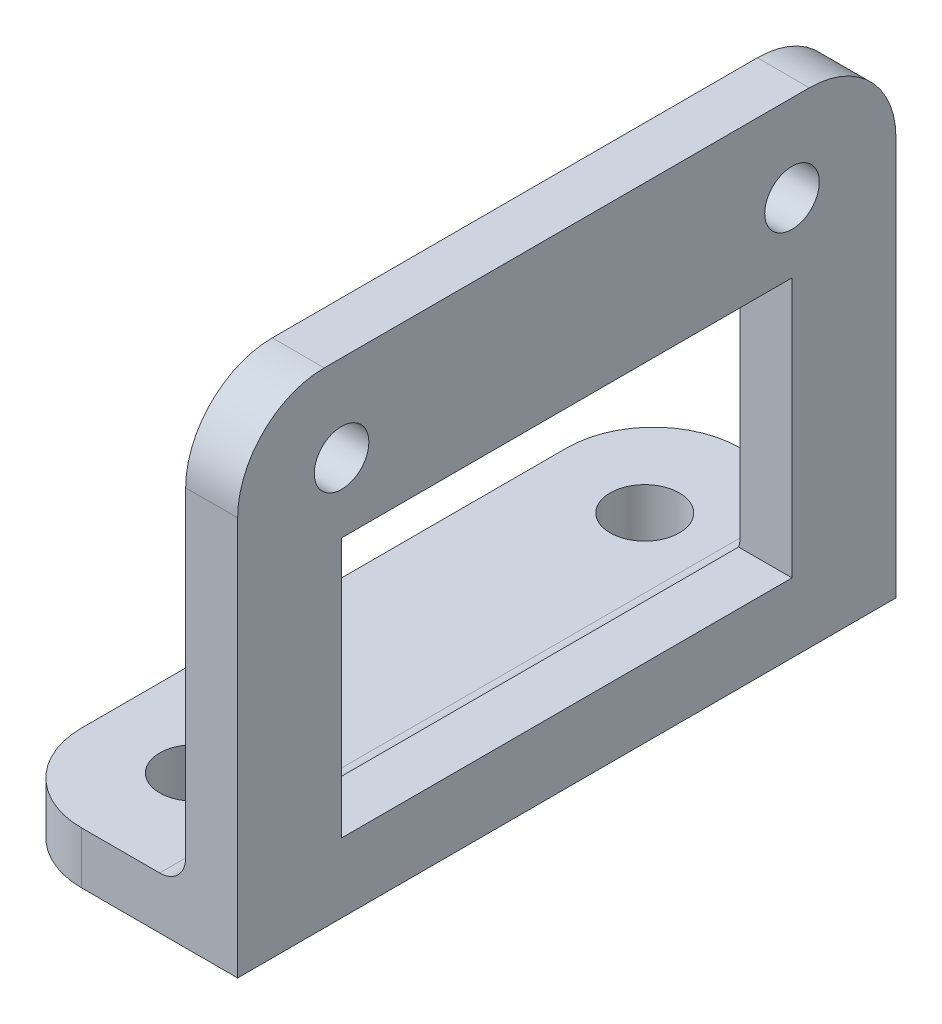
ISO-10303-21;
HEADER;
FILE_DESCRIPTION(('STEP AP214'),'2;1');
FILE_NAME('part.step','',(''),(''),'','','');
FILE_SCHEMA(('AUTOMOTIVE_DESIGN { 1 0 10303 214 1 1 1 1 }'));
ENDSEC;
DATA;
#1=APPLICATION_CONTEXT('core data for automotive mechanical design processes');
#2=APPLICATION_PROTOCOL_DEFINITION('international standard','automotive_design',2000,#1);
#3=PRODUCT_CONTEXT('',#1,'mechanical');
#4=PRODUCT('Part','Part','',(#3));
#5=PRODUCT_RELATED_PRODUCT_CATEGORY('part','',(#4));
#6=PRODUCT_DEFINITION_FORMATION('','',#4);
#7=PRODUCT_DEFINITION_CONTEXT('part definition',#1,'design');
#8=PRODUCT_DEFINITION('design','',#6,#7);
#9=PRODUCT_DEFINITION_SHAPE('','',#8);
#10=(LENGTH_UNIT() NAMED_UNIT(*) SI_UNIT(.MILLI.,.METRE.));
#11=(NAMED_UNIT(*) PLANE_ANGLE_UNIT() SI_UNIT($,.RADIAN.));
#12=(NAMED_UNIT(*) SI_UNIT($,.STERADIAN.) SOLID_ANGLE_UNIT());
#13=UNCERTAINTY_MEASURE_WITH_UNIT(LENGTH_MEASURE(1.E-05),#10,'distance_accuracy_value','');
#14=(GEOMETRIC_REPRESENTATION_CONTEXT(3) GLOBAL_UNCERTAINTY_ASSIGNED_CONTEXT((#13)) GLOBAL_UNIT_ASSIGNED_CONTEXT((#10,
#11,#12)) REPRESENTATION_CONTEXT('',''));
#15=CARTESIAN_POINT('',(0.,0.,0.));
#16=DIRECTION('',(0.,0.,1.));
#17=DIRECTION('',(1.,0.,0.));
#18=AXIS2_PLACEMENT_3D('',#15,#16,#17);
#19=CARTESIAN_POINT('',(0.,0.,19.));
#20=DIRECTION('',(0.,1.,0.));
#21=DIRECTION('',(0.,0.,1.));
#22=AXIS2_PLACEMENT_3D('',#19,#20,#21);
#23=PLANE('',#22);
#24=CARTESIAN_POINT('',(-4.5,0.,-13.));
#25=DIRECTION('',(0.,1.,0.));
#26=DIRECTION('',(-1.,0.,0.));
#27=AXIS2_PLACEMENT_3D('',#24,#25,#26);
#28=CIRCLE('',#27,2.);
#29=CARTESIAN_POINT('',(-6.5,0.,-13.));
#30=VERTEX_POINT('',#29);
#31=EDGE_CURVE('E223',#30,#30,#28,.T.);
#32=ORIENTED_EDGE('',*,*,#31,.T.);
#33=EDGE_LOOP('',(#32));
#34=FACE_BOUND('',#33,.T.);
#35=CARTESIAN_POINT('',(-4.5,0.,13.));
#36=DIRECTION('',(0.,1.,0.));
#37=DIRECTION('',(1.,0.,0.));
#38=AXIS2_PLACEMENT_3D('',#35,#36,#37);
#39=CIRCLE('',#38,2.);
#40=CARTESIAN_POINT('',(-2.5,0.,13.));
#41=VERTEX_POINT('',#40);
#42=EDGE_CURVE('E217',#41,#41,#39,.T.);
#43=ORIENTED_EDGE('',*,*,#42,.T.);
#44=EDGE_LOOP('',(#43));
#45=FACE_BOUND('',#44,.T.);
#46=DIRECTION('',(0.,0.,-1.));
#47=VECTOR('',#46,1.);
#48=CARTESIAN_POINT('',(-10.,0.,19.));
#49=LINE('',#48,#47);
#50=CARTESIAN_POINT('',(-10.,0.,14.));
#51=VERTEX_POINT('',#50);
#52=CARTESIAN_POINT('',(-10.,0.,-14.));
#53=VERTEX_POINT('',#52);
#54=EDGE_CURVE('E245',#51,#53,#49,.T.);
#55=ORIENTED_EDGE('',*,*,#54,.T.);
#56=CARTESIAN_POINT('',(-5.,0.,-14.));
#57=DIRECTION('',(0.,1.,0.));
#58=DIRECTION('',(0.,0.,1.));
#59=AXIS2_PLACEMENT_3D('',#56,#57,#58);
#60=CIRCLE('',#59,5.);
#61=CARTESIAN_POINT('',(-5.,0.,-19.));
#62=VERTEX_POINT('',#61);
#63=EDGE_CURVE('E345',#53,#62,#60,.F.);
#64=ORIENTED_EDGE('',*,*,#63,.T.);
#65=DIRECTION('',(1.,0.,0.));
#66=VECTOR('',#65,1.);
#67=CARTESIAN_POINT('',(0.,0.,-19.));
#68=LINE('',#67,#66);
#69=CARTESIAN_POINT('',(4.,0.,-19.));
#70=VERTEX_POINT('',#69);
#71=EDGE_CURVE('E246',#62,#70,#68,.T.);
#72=ORIENTED_EDGE('',*,*,#71,.T.);
#73=DIRECTION('',(0.,0.,-1.));
#74=VECTOR('',#73,1.);
#75=CARTESIAN_POINT('',(4.,0.,19.));
#76=LINE('',#75,#74);
#77=CARTESIAN_POINT('',(4.,0.,19.));
#78=VERTEX_POINT('',#77);
#79=EDGE_CURVE('E274',#78,#70,#76,.T.);
#80=ORIENTED_EDGE('',*,*,#79,.F.);
#81=DIRECTION('',(1.,0.,0.));
#82=VECTOR('',#81,1.);
#83=CARTESIAN_POINT('',(0.,0.,19.));
#84=LINE('',#83,#82);
#85=CARTESIAN_POINT('',(-5.,0.,19.));
#86=VERTEX_POINT('',#85);
#87=EDGE_CURVE('E231',#86,#78,#84,.T.);
#88=ORIENTED_EDGE('',*,*,#87,.F.);
#89=CARTESIAN_POINT('',(-5.,0.,14.));
#90=DIRECTION('',(0.,1.,0.));
#91=DIRECTION('',(0.,0.,1.));
#92=AXIS2_PLACEMENT_3D('',#89,#90,#91);
#93=CIRCLE('',#92,5.);
#94=EDGE_CURVE('E69',#86,#51,#93,.F.);
#95=ORIENTED_EDGE('',*,*,#94,.T.);
#96=EDGE_LOOP('',(#55,#64,#72,#80,#88,#95));
#97=FACE_BOUND('',#96,.T.);
#98=ADVANCED_FACE('F45',(#34,#45,#97),#23,.F.);
#99=CARTESIAN_POINT('',(4.,0.,19.));
#100=DIRECTION('',(-1.,0.,0.));
#101=DIRECTION('',(0.,0.,1.));
#102=AXIS2_PLACEMENT_3D('',#99,#100,#101);
#103=PLANE('',#102);
#104=DIRECTION('',(0.,0.,1.));
#105=VECTOR('',#104,1.);
#106=CARTESIAN_POINT('',(4.,4.,-13.));
#107=LINE('',#106,#105);
#108=CARTESIAN_POINT('',(4.,4.,-13.));
#109=VERTEX_POINT('',#108);
#110=CARTESIAN_POINT('',(4.,4.,13.));
#111=VERTEX_POINT('',#110);
#112=EDGE_CURVE('E205',#109,#111,#107,.T.);
#113=ORIENTED_EDGE('',*,*,#112,.T.);
#114=DIRECTION('',(0.,1.,0.));
#115=VECTOR('',#114,1.);
#116=CARTESIAN_POINT('',(4.,4.,13.));
#117=LINE('',#116,#115);
#118=CARTESIAN_POINT('',(4.,19.,13.));
#119=VERTEX_POINT('',#118);
#120=EDGE_CURVE('E192',#111,#119,#117,.T.);
#121=ORIENTED_EDGE('',*,*,#120,.T.);
#122=DIRECTION('',(0.,0.,-1.));
#123=VECTOR('',#122,1.);
#124=CARTESIAN_POINT('',(4.,19.,-13.));
#125=LINE('',#124,#123);
#126=CARTESIAN_POINT('',(4.,19.,-13.));
#127=VERTEX_POINT('',#126);
#128=EDGE_CURVE('E196',#119,#127,#125,.T.);
#129=ORIENTED_EDGE('',*,*,#128,.T.);
#130=DIRECTION('',(0.,-1.,0.));
#131=VECTOR('',#130,1.);
#132=CARTESIAN_POINT('',(4.,4.,-13.));
#133=LINE('',#132,#131);
#134=EDGE_CURVE('E169',#127,#109,#133,.T.);
#135=ORIENTED_EDGE('',*,*,#134,.T.);
#136=EDGE_LOOP('',(#113,#121,#129,#135));
#137=FACE_BOUND('',#136,.T.);
#138=CARTESIAN_POINT('',(4.,23.,13.));
#139=DIRECTION('',(-1.,0.,0.));
#140=DIRECTION('',(0.,0.,-1.));
#141=AXIS2_PLACEMENT_3D('',#138,#139,#140);
#142=CIRCLE('',#141,1.575);
#143=CARTESIAN_POINT('',(4.,23.,11.425));
#144=VERTEX_POINT('',#143);
#145=EDGE_CURVE('E204',#144,#144,#142,.T.);
#146=ORIENTED_EDGE('',*,*,#145,.T.);
#147=EDGE_LOOP('',(#146));
#148=FACE_BOUND('',#147,.T.);
#149=CARTESIAN_POINT('',(4.,23.,-13.));
#150=DIRECTION('',(-1.,0.,0.));
#151=DIRECTION('',(0.,0.,1.));
#152=AXIS2_PLACEMENT_3D('',#149,#150,#151);
#153=CIRCLE('',#152,1.575);
#154=CARTESIAN_POINT('',(4.,23.,-11.425));
#155=VERTEX_POINT('',#154);
#156=EDGE_CURVE('E213',#155,#155,#153,.T.);
#157=ORIENTED_EDGE('',*,*,#156,.T.);
#158=EDGE_LOOP('',(#157));
#159=FACE_BOUND('',#158,.T.);
#160=DIRECTION('',(0.,1.,0.));
#161=VECTOR('',#160,1.);
#162=CARTESIAN_POINT('',(4.,0.,-19.));
#163=LINE('',#162,#161);
#164=CARTESIAN_POINT('',(4.,23.,-19.));
#165=VERTEX_POINT('',#164);
#166=EDGE_CURVE('E249',#70,#165,#163,.T.);
#167=ORIENTED_EDGE('',*,*,#166,.T.);
#168=CARTESIAN_POINT('',(4.,23.,-14.));
#169=DIRECTION('',(-1.,0.,0.));
#170=DIRECTION('',(0.,0.,1.));
#171=AXIS2_PLACEMENT_3D('',#168,#169,#170);
#172=CIRCLE('',#171,5.);
#173=CARTESIAN_POINT('',(4.,28.,-14.));
#174=VERTEX_POINT('',#173);
#175=EDGE_CURVE('E333',#165,#174,#172,.F.);
#176=ORIENTED_EDGE('',*,*,#175,.T.);
#177=DIRECTION('',(0.,0.,-1.));
#178=VECTOR('',#177,1.);
#179=CARTESIAN_POINT('',(4.,28.,19.));
#180=LINE('',#179,#178);
#181=CARTESIAN_POINT('',(4.,28.,14.));
#182=VERTEX_POINT('',#181);
#183=EDGE_CURVE('E270',#182,#174,#180,.T.);
#184=ORIENTED_EDGE('',*,*,#183,.F.);
#185=CARTESIAN_POINT('',(4.,23.,14.));
#186=DIRECTION('',(-1.,0.,0.));
#187=DIRECTION('',(0.,0.,1.));
#188=AXIS2_PLACEMENT_3D('',#185,#186,#187);
#189=CIRCLE('',#188,5.);
#190=CARTESIAN_POINT('',(4.,23.,19.));
#191=VERTEX_POINT('',#190);
#192=EDGE_CURVE('E330',#182,#191,#189,.F.);
#193=ORIENTED_EDGE('',*,*,#192,.T.);
#194=DIRECTION('',(0.,1.,0.));
#195=VECTOR('',#194,1.);
#196=CARTESIAN_POINT('',(4.,0.,19.));
#197=LINE('',#196,#195);
#198=EDGE_CURVE('E234',#78,#191,#197,.T.);
#199=ORIENTED_EDGE('',*,*,#198,.F.);
#200=ORIENTED_EDGE('',*,*,#79,.T.);
#201=EDGE_LOOP('',(#167,#176,#184,#193,#199,#200));
#202=FACE_BOUND('',#201,.T.);
#203=ADVANCED_FACE('F388',(#137,#148,#159,#202),#103,.F.);
#204=CARTESIAN_POINT('',(1.,28.,19.));
#205=DIRECTION('',(0.,-1.,0.));
#206=DIRECTION('',(0.,0.,-1.));
#207=AXIS2_PLACEMENT_3D('',#204,#205,#206);
#208=PLANE('',#207);
#209=ORIENTED_EDGE('',*,*,#183,.T.);
#210=DIRECTION('',(-1.,0.,0.));
#211=VECTOR('',#210,1.);
#212=CARTESIAN_POINT('',(1.,28.,-14.));
#213=LINE('',#212,#211);
#214=CARTESIAN_POINT('',(1.,28.,-14.));
#215=VERTEX_POINT('',#214);
#216=EDGE_CURVE('E314',#174,#215,#213,.T.);
#217=ORIENTED_EDGE('',*,*,#216,.T.);
#218=DIRECTION('',(0.,0.,-1.));
#219=VECTOR('',#218,1.);
#220=CARTESIAN_POINT('',(1.,28.,19.));
#221=LINE('',#220,#219);
#222=CARTESIAN_POINT('',(1.,28.,14.));
#223=VERTEX_POINT('',#222);
#224=EDGE_CURVE('E267',#223,#215,#221,.T.);
#225=ORIENTED_EDGE('',*,*,#224,.F.);
#226=DIRECTION('',(-1.,0.,0.));
#227=VECTOR('',#226,1.);
#228=CARTESIAN_POINT('',(1.,28.,14.));
#229=LINE('',#228,#227);
#230=EDGE_CURVE('E311',#223,#182,#229,.F.);
#231=ORIENTED_EDGE('',*,*,#230,.T.);
#232=EDGE_LOOP('',(#209,#217,#225,#231));
#233=FACE_BOUND('',#232,.T.);
#234=ADVANCED_FACE('F392',(#233),#208,.F.);
#235=CARTESIAN_POINT('',(1.,3.,19.));
#236=DIRECTION('',(1.,0.,0.));
#237=DIRECTION('',(0.,1.,0.));
#238=AXIS2_PLACEMENT_3D('',#235,#236,#237);
#239=PLANE('',#238);
#240=ORIENTED_EDGE('',*,*,#224,.T.);
#241=CARTESIAN_POINT('',(1.,23.,-14.));
#242=DIRECTION('',(1.,0.,0.));
#243=DIRECTION('',(0.,1.,0.));
#244=AXIS2_PLACEMENT_3D('',#241,#242,#243);
#245=CIRCLE('',#244,5.);
#246=CARTESIAN_POINT('',(1.,23.,-19.));
#247=VERTEX_POINT('',#246);
#248=EDGE_CURVE('E321',#215,#247,#245,.F.);
#249=ORIENTED_EDGE('',*,*,#248,.T.);
#250=DIRECTION('',(0.,-1.,0.));
#251=VECTOR('',#250,1.);
#252=CARTESIAN_POINT('',(1.,3.,-19.));
#253=LINE('',#252,#251);
#254=CARTESIAN_POINT('',(1.,4.5,-19.));
#255=VERTEX_POINT('',#254);
#256=EDGE_CURVE('E254',#247,#255,#253,.T.);
#257=ORIENTED_EDGE('',*,*,#256,.T.);
#258=DIRECTION('',(0.,0.,-1.));
#259=VECTOR('',#258,1.);
#260=CARTESIAN_POINT('',(1.,4.5,19.));
#261=LINE('',#260,#259);
#262=CARTESIAN_POINT('',(1.,4.5,-13.));
#263=VERTEX_POINT('',#262);
#264=EDGE_CURVE('E190',#255,#263,#261,.F.);
#265=ORIENTED_EDGE('',*,*,#264,.T.);
#266=DIRECTION('',(0.,-1.,0.));
#267=VECTOR('',#266,1.);
#268=CARTESIAN_POINT('',(1.,4.,-13.));
#269=LINE('',#268,#267);
#270=CARTESIAN_POINT('',(1.,19.,-13.));
#271=VERTEX_POINT('',#270);
#272=EDGE_CURVE('E166',#271,#263,#269,.T.);
#273=ORIENTED_EDGE('',*,*,#272,.F.);
#274=DIRECTION('',(0.,0.,-1.));
#275=VECTOR('',#274,1.);
#276=CARTESIAN_POINT('',(1.,19.,-13.));
#277=LINE('',#276,#275);
#278=CARTESIAN_POINT('',(1.,19.,13.));
#279=VERTEX_POINT('',#278);
#280=EDGE_CURVE('E179',#279,#271,#277,.T.);
#281=ORIENTED_EDGE('',*,*,#280,.F.);
#282=DIRECTION('',(0.,1.,0.));
#283=VECTOR('',#282,1.);
#284=CARTESIAN_POINT('',(1.,4.,13.));
#285=LINE('',#284,#283);
#286=CARTESIAN_POINT('',(1.,4.5,13.));
#287=VERTEX_POINT('',#286);
#288=EDGE_CURVE('E184',#287,#279,#285,.T.);
#289=ORIENTED_EDGE('',*,*,#288,.F.);
#290=DIRECTION('',(0.,0.,-1.));
#291=VECTOR('',#290,1.);
#292=CARTESIAN_POINT('',(1.,4.5,19.));
#293=LINE('',#292,#291);
#294=CARTESIAN_POINT('',(1.,4.5,19.));
#295=VERTEX_POINT('',#294);
#296=EDGE_CURVE('E288',#287,#295,#293,.F.);
#297=ORIENTED_EDGE('',*,*,#296,.T.);
#298=DIRECTION('',(0.,-1.,0.));
#299=VECTOR('',#298,1.);
#300=CARTESIAN_POINT('',(1.,3.,19.));
#301=LINE('',#300,#299);
#302=CARTESIAN_POINT('',(1.,23.,19.));
#303=VERTEX_POINT('',#302);
#304=EDGE_CURVE('E239',#303,#295,#301,.T.);
#305=ORIENTED_EDGE('',*,*,#304,.F.);
#306=CARTESIAN_POINT('',(1.,23.,14.));
#307=DIRECTION('',(1.,0.,0.));
#308=DIRECTION('',(0.,1.,0.));
#309=AXIS2_PLACEMENT_3D('',#306,#307,#308);
#310=CIRCLE('',#309,5.);
#311=EDGE_CURVE('E318',#303,#223,#310,.F.);
#312=ORIENTED_EDGE('',*,*,#311,.T.);
#313=EDGE_LOOP('',(#240,#249,#257,#265,#273,#281,#289,#297,#305,#312));
#314=FACE_BOUND('',#313,.T.);
#315=CARTESIAN_POINT('',(1.,23.,13.));
#316=DIRECTION('',(-1.,0.,0.));
#317=DIRECTION('',(0.,0.,-1.));
#318=AXIS2_PLACEMENT_3D('',#315,#316,#317);
#319=CIRCLE('',#318,1.575);
#320=CARTESIAN_POINT('',(1.,23.,11.425));
#321=VERTEX_POINT('',#320);
#322=EDGE_CURVE('E222',#321,#321,#319,.T.);
#323=ORIENTED_EDGE('',*,*,#322,.F.);
#324=EDGE_LOOP('',(#323));
#325=FACE_BOUND('',#324,.T.);
#326=CARTESIAN_POINT('',(1.,23.,-13.));
#327=DIRECTION('',(-1.,0.,0.));
#328=DIRECTION('',(0.,0.,1.));
#329=AXIS2_PLACEMENT_3D('',#326,#327,#328);
#330=CIRCLE('',#329,1.575);
#331=CARTESIAN_POINT('',(1.,23.,-11.425));
#332=VERTEX_POINT('',#331);
#333=EDGE_CURVE('E218',#332,#332,#330,.T.);
#334=ORIENTED_EDGE('',*,*,#333,.F.);
#335=EDGE_LOOP('',(#334));
#336=FACE_BOUND('',#335,.T.);
#337=ADVANCED_FACE('F187',(#314,#325,#336),#239,.F.);
#338=CARTESIAN_POINT('',(1.,3.,19.));
#339=DIRECTION('',(0.,-1.,0.));
#340=DIRECTION('',(1.,0.,0.));
#341=AXIS2_PLACEMENT_3D('',#338,#339,#340);
#342=PLANE('',#341);
#343=CARTESIAN_POINT('',(-4.5,3.,-13.));
#344=DIRECTION('',(0.,-1.,0.));
#345=DIRECTION('',(1.,0.,0.));
#346=AXIS2_PLACEMENT_3D('',#343,#344,#345);
#347=CIRCLE('',#346,2.);
#348=CARTESIAN_POINT('',(-2.5,3.,-13.));
#349=VERTEX_POINT('',#348);
#350=EDGE_CURVE('E250',#349,#349,#347,.T.);
#351=ORIENTED_EDGE('',*,*,#350,.T.);
#352=EDGE_LOOP('',(#351));
#353=FACE_BOUND('',#352,.T.);
#354=CARTESIAN_POINT('',(-4.5,3.,13.));
#355=DIRECTION('',(0.,-1.,0.));
#356=DIRECTION('',(1.,0.,0.));
#357=AXIS2_PLACEMENT_3D('',#354,#355,#356);
#358=CIRCLE('',#357,2.);
#359=CARTESIAN_POINT('',(-2.5,3.,13.));
#360=VERTEX_POINT('',#359);
#361=EDGE_CURVE('E227',#360,#360,#358,.T.);
#362=ORIENTED_EDGE('',*,*,#361,.T.);
#363=EDGE_LOOP('',(#362));
#364=FACE_BOUND('',#363,.T.);
#365=DIRECTION('',(-1.,0.,0.));
#366=VECTOR('',#365,1.);
#367=CARTESIAN_POINT('',(1.,3.,-19.));
#368=LINE('',#367,#366);
#369=CARTESIAN_POINT('',(-0.5,3.,-19.));
#370=VERTEX_POINT('',#369);
#371=CARTESIAN_POINT('',(-5.,3.,-19.));
#372=VERTEX_POINT('',#371);
#373=EDGE_CURVE('E235',#370,#372,#368,.T.);
#374=ORIENTED_EDGE('',*,*,#373,.T.);
#375=CARTESIAN_POINT('',(-5.,3.,-14.));
#376=DIRECTION('',(0.,-1.,0.));
#377=DIRECTION('',(1.,0.,0.));
#378=AXIS2_PLACEMENT_3D('',#375,#376,#377);
#379=CIRCLE('',#378,5.);
#380=CARTESIAN_POINT('',(-10.,3.,-14.));
#381=VERTEX_POINT('',#380);
#382=EDGE_CURVE('E350',#372,#381,#379,.F.);
#383=ORIENTED_EDGE('',*,*,#382,.T.);
#384=DIRECTION('',(0.,0.,-1.));
#385=VECTOR('',#384,1.);
#386=CARTESIAN_POINT('',(-10.,3.,19.));
#387=LINE('',#386,#385);
#388=CARTESIAN_POINT('',(-10.,3.,14.));
#389=VERTEX_POINT('',#388);
#390=EDGE_CURVE('E263',#389,#381,#387,.T.);
#391=ORIENTED_EDGE('',*,*,#390,.F.);
#392=CARTESIAN_POINT('',(-5.,3.,14.));
#393=DIRECTION('',(0.,-1.,0.));
#394=DIRECTION('',(1.,0.,0.));
#395=AXIS2_PLACEMENT_3D('',#392,#393,#394);
#396=CIRCLE('',#395,5.);
#397=CARTESIAN_POINT('',(-5.,3.,19.));
#398=VERTEX_POINT('',#397);
#399=EDGE_CURVE('E61',#389,#398,#396,.F.);
#400=ORIENTED_EDGE('',*,*,#399,.T.);
#401=DIRECTION('',(-1.,0.,0.));
#402=VECTOR('',#401,1.);
#403=CARTESIAN_POINT('',(1.,3.,19.));
#404=LINE('',#403,#402);
#405=CARTESIAN_POINT('',(-0.5,3.,19.));
#406=VERTEX_POINT('',#405);
#407=EDGE_CURVE('E242',#406,#398,#404,.T.);
#408=ORIENTED_EDGE('',*,*,#407,.F.);
#409=DIRECTION('',(0.,0.,-1.));
#410=VECTOR('',#409,1.);
#411=CARTESIAN_POINT('',(-0.5,3.,-19.));
#412=LINE('',#411,#410);
#413=EDGE_CURVE('E278',#406,#370,#412,.T.);
#414=ORIENTED_EDGE('',*,*,#413,.T.);
#415=EDGE_LOOP('',(#374,#383,#391,#400,#408,#414));
#416=FACE_BOUND('',#415,.T.);
#417=ADVANCED_FACE('F368',(#353,#364,#416),#342,.F.);
#418=CARTESIAN_POINT('',(-10.,0.,19.));
#419=DIRECTION('',(1.,0.,0.));
#420=DIRECTION('',(0.,0.,-1.));
#421=AXIS2_PLACEMENT_3D('',#418,#419,#420);
#422=PLANE('',#421);
#423=ORIENTED_EDGE('',*,*,#390,.T.);
#424=DIRECTION('',(0.,-1.,0.));
#425=VECTOR('',#424,1.);
#426=CARTESIAN_POINT('',(-10.,0.,-14.));
#427=LINE('',#426,#425);
#428=EDGE_CURVE('E339',#381,#53,#427,.T.);
#429=ORIENTED_EDGE('',*,*,#428,.T.);
#430=ORIENTED_EDGE('',*,*,#54,.F.);
#431=DIRECTION('',(0.,-1.,0.));
#432=VECTOR('',#431,1.);
#433=CARTESIAN_POINT('',(-10.,0.,14.));
#434=LINE('',#433,#432);
#435=EDGE_CURVE('E336',#51,#389,#434,.F.);
#436=ORIENTED_EDGE('',*,*,#435,.T.);
#437=EDGE_LOOP('',(#423,#429,#430,#436));
#438=FACE_BOUND('',#437,.T.);
#439=ADVANCED_FACE('F381',(#438),#422,.F.);
#440=CARTESIAN_POINT('',(0.,0.,19.));
#441=DIRECTION('',(0.,0.,-1.));
#442=DIRECTION('',(-1.,0.,0.));
#443=AXIS2_PLACEMENT_3D('',#440,#441,#442);
#444=PLANE('',#443);
#445=ORIENTED_EDGE('',*,*,#407,.T.);
#446=DIRECTION('',(0.,-1.,0.));
#447=VECTOR('',#446,1.);
#448=CARTESIAN_POINT('',(-5.,0.,19.));
#449=LINE('',#448,#447);
#450=EDGE_CURVE('E11',#398,#86,#449,.T.);
#451=ORIENTED_EDGE('',*,*,#450,.T.);
#452=ORIENTED_EDGE('',*,*,#87,.T.);
#453=ORIENTED_EDGE('',*,*,#198,.T.);
#454=DIRECTION('',(-1.,0.,0.));
#455=VECTOR('',#454,1.);
#456=CARTESIAN_POINT('',(0.,23.,19.));
#457=LINE('',#456,#455);
#458=EDGE_CURVE('E54',#191,#303,#457,.T.);
#459=ORIENTED_EDGE('',*,*,#458,.T.);
#460=ORIENTED_EDGE('',*,*,#304,.T.);
#461=CARTESIAN_POINT('',(-0.5,4.5,19.));
#462=DIRECTION('',(0.,0.,-1.));
#463=DIRECTION('',(-1.,0.,0.));
#464=AXIS2_PLACEMENT_3D('',#461,#462,#463);
#465=CIRCLE('',#464,1.5);
#466=EDGE_CURVE('E308',#295,#406,#465,.T.);
#467=ORIENTED_EDGE('',*,*,#466,.T.);
#468=EDGE_LOOP('',(#445,#451,#452,#453,#459,#460,#467));
#469=FACE_BOUND('',#468,.T.);
#470=ADVANCED_FACE('F357',(#469),#444,.F.);
#471=CARTESIAN_POINT('',(0.,0.,-19.));
#472=DIRECTION('',(0.,0.,-1.));
#473=DIRECTION('',(-1.,0.,0.));
#474=AXIS2_PLACEMENT_3D('',#471,#472,#473);
#475=PLANE('',#474);
#476=ORIENTED_EDGE('',*,*,#256,.F.);
#477=DIRECTION('',(-1.,0.,0.));
#478=VECTOR('',#477,1.);
#479=CARTESIAN_POINT('',(4.,23.,-19.));
#480=LINE('',#479,#478);
#481=EDGE_CURVE('E327',#247,#165,#480,.F.);
#482=ORIENTED_EDGE('',*,*,#481,.T.);
#483=ORIENTED_EDGE('',*,*,#166,.F.);
#484=ORIENTED_EDGE('',*,*,#71,.F.);
#485=DIRECTION('',(0.,-1.,0.));
#486=VECTOR('',#485,1.);
#487=CARTESIAN_POINT('',(-5.,3.,-19.));
#488=LINE('',#487,#486);
#489=EDGE_CURVE('E324',#62,#372,#488,.F.);
#490=ORIENTED_EDGE('',*,*,#489,.T.);
#491=ORIENTED_EDGE('',*,*,#373,.F.);
#492=CARTESIAN_POINT('',(-0.5,4.5,-19.));
#493=DIRECTION('',(0.,0.,-1.));
#494=DIRECTION('',(-1.,0.,0.));
#495=AXIS2_PLACEMENT_3D('',#492,#493,#494);
#496=CIRCLE('',#495,1.5);
#497=EDGE_CURVE('E294',#370,#255,#496,.F.);
#498=ORIENTED_EDGE('',*,*,#497,.T.);
#499=EDGE_LOOP('',(#476,#482,#483,#484,#490,#491,#498));
#500=FACE_BOUND('',#499,.T.);
#501=ADVANCED_FACE('F373',(#500),#475,.T.);
#502=CARTESIAN_POINT('',(-4.5,0.,13.));
#503=DIRECTION('',(0.,1.,0.));
#504=DIRECTION('',(-1.,0.,0.));
#505=AXIS2_PLACEMENT_3D('',#502,#503,#504);
#506=CYLINDRICAL_SURFACE('',#505,2.);
#507=ORIENTED_EDGE('',*,*,#42,.F.);
#508=EDGE_LOOP('',(#507));
#509=FACE_BOUND('',#508,.T.);
#510=ORIENTED_EDGE('',*,*,#361,.F.);
#511=EDGE_LOOP('',(#510));
#512=FACE_BOUND('',#511,.T.);
#513=ADVANCED_FACE('F427',(#509,#512),#506,.F.);
#514=CARTESIAN_POINT('',(-4.5,0.,-13.));
#515=DIRECTION('',(0.,1.,0.));
#516=DIRECTION('',(-1.,0.,0.));
#517=AXIS2_PLACEMENT_3D('',#514,#515,#516);
#518=CYLINDRICAL_SURFACE('',#517,2.);
#519=ORIENTED_EDGE('',*,*,#31,.F.);
#520=EDGE_LOOP('',(#519));
#521=FACE_BOUND('',#520,.T.);
#522=ORIENTED_EDGE('',*,*,#350,.F.);
#523=EDGE_LOOP('',(#522));
#524=FACE_BOUND('',#523,.T.);
#525=ADVANCED_FACE('F432',(#521,#524),#518,.F.);
#526=CARTESIAN_POINT('',(4.,23.,-13.));
#527=DIRECTION('',(-1.,0.,0.));
#528=DIRECTION('',(0.,0.,1.));
#529=AXIS2_PLACEMENT_3D('',#526,#527,#528);
#530=CYLINDRICAL_SURFACE('',#529,1.575);
#531=ORIENTED_EDGE('',*,*,#156,.F.);
#532=EDGE_LOOP('',(#531));
#533=FACE_BOUND('',#532,.T.);
#534=ORIENTED_EDGE('',*,*,#333,.T.);
#535=EDGE_LOOP('',(#534));
#536=FACE_BOUND('',#535,.T.);
#537=ADVANCED_FACE('F436',(#533,#536),#530,.F.);
#538=CARTESIAN_POINT('',(4.,23.,13.));
#539=DIRECTION('',(-1.,0.,0.));
#540=DIRECTION('',(0.,0.,1.));
#541=AXIS2_PLACEMENT_3D('',#538,#539,#540);
#542=CYLINDRICAL_SURFACE('',#541,1.575);
#543=ORIENTED_EDGE('',*,*,#145,.F.);
#544=EDGE_LOOP('',(#543));
#545=FACE_BOUND('',#544,.T.);
#546=ORIENTED_EDGE('',*,*,#322,.T.);
#547=EDGE_LOOP('',(#546));
#548=FACE_BOUND('',#547,.T.);
#549=ADVANCED_FACE('F440',(#545,#548),#542,.F.);
#550=CARTESIAN_POINT('',(4.,4.,13.));
#551=DIRECTION('',(0.,0.,1.));
#552=DIRECTION('',(1.,0.,0.));
#553=AXIS2_PLACEMENT_3D('',#550,#551,#552);
#554=PLANE('',#553);
#555=DIRECTION('',(-1.,0.,0.));
#556=VECTOR('',#555,1.);
#557=CARTESIAN_POINT('',(4.,4.,13.));
#558=LINE('',#557,#556);
#559=CARTESIAN_POINT('',(0.914213562373124,4.,13.));
#560=VERTEX_POINT('',#559);
#561=EDGE_CURVE('E199',#111,#560,#558,.T.);
#562=ORIENTED_EDGE('',*,*,#561,.T.);
#563=CARTESIAN_POINT('',(-0.5,4.5,13.));
#564=DIRECTION('',(0.,0.,1.));
#565=DIRECTION('',(1.,0.,0.));
#566=AXIS2_PLACEMENT_3D('',#563,#564,#565);
#567=CIRCLE('',#566,1.5);
#568=EDGE_CURVE('E305',#560,#287,#567,.T.);
#569=ORIENTED_EDGE('',*,*,#568,.T.);
#570=ORIENTED_EDGE('',*,*,#288,.T.);
#571=DIRECTION('',(-1.,0.,0.));
#572=VECTOR('',#571,1.);
#573=CARTESIAN_POINT('',(4.,19.,13.));
#574=LINE('',#573,#572);
#575=EDGE_CURVE('E174',#119,#279,#574,.T.);
#576=ORIENTED_EDGE('',*,*,#575,.F.);
#577=ORIENTED_EDGE('',*,*,#120,.F.);
#578=EDGE_LOOP('',(#562,#569,#570,#576,#577));
#579=FACE_BOUND('',#578,.T.);
#580=ADVANCED_FACE('F445',(#579),#554,.F.);
#581=CARTESIAN_POINT('',(4.,4.,-13.));
#582=DIRECTION('',(0.,-1.,0.));
#583=DIRECTION('',(0.,0.,-1.));
#584=AXIS2_PLACEMENT_3D('',#581,#582,#583);
#585=PLANE('',#584);
#586=DIRECTION('',(-1.,0.,0.));
#587=VECTOR('',#586,1.);
#588=CARTESIAN_POINT('',(4.,4.,-13.));
#589=LINE('',#588,#587);
#590=CARTESIAN_POINT('',(0.914213562373123,4.,-13.));
#591=VERTEX_POINT('',#590);
#592=EDGE_CURVE('E175',#109,#591,#589,.T.);
#593=ORIENTED_EDGE('',*,*,#592,.T.);
#594=DIRECTION('',(0.,0.,1.));
#595=VECTOR('',#594,1.);
#596=CARTESIAN_POINT('',(0.914213562373123,4.,-13.));
#597=LINE('',#596,#595);
#598=EDGE_CURVE('E301',#591,#560,#597,.T.);
#599=ORIENTED_EDGE('',*,*,#598,.T.);
#600=ORIENTED_EDGE('',*,*,#561,.F.);
#601=ORIENTED_EDGE('',*,*,#112,.F.);
#602=EDGE_LOOP('',(#593,#599,#600,#601));
#603=FACE_BOUND('',#602,.T.);
#604=ADVANCED_FACE('F442',(#603),#585,.F.);
#605=CARTESIAN_POINT('',(4.,4.,-13.));
#606=DIRECTION('',(0.,0.,-1.));
#607=DIRECTION('',(0.,1.,0.));
#608=AXIS2_PLACEMENT_3D('',#605,#606,#607);
#609=PLANE('',#608);
#610=ORIENTED_EDGE('',*,*,#272,.T.);
#611=CARTESIAN_POINT('',(-0.5,4.5,-13.));
#612=DIRECTION('',(0.,0.,-1.));
#613=DIRECTION('',(0.,1.,0.));
#614=AXIS2_PLACEMENT_3D('',#611,#612,#613);
#615=CIRCLE('',#614,1.5);
#616=EDGE_CURVE('E298',#263,#591,#615,.T.);
#617=ORIENTED_EDGE('',*,*,#616,.T.);
#618=ORIENTED_EDGE('',*,*,#592,.F.);
#619=ORIENTED_EDGE('',*,*,#134,.F.);
#620=DIRECTION('',(-1.,0.,0.));
#621=VECTOR('',#620,1.);
#622=CARTESIAN_POINT('',(4.,19.,-13.));
#623=LINE('',#622,#621);
#624=EDGE_CURVE('E161',#127,#271,#623,.T.);
#625=ORIENTED_EDGE('',*,*,#624,.T.);
#626=EDGE_LOOP('',(#610,#617,#618,#619,#625));
#627=FACE_BOUND('',#626,.T.);
#628=ADVANCED_FACE('F163',(#627),#609,.F.);
#629=CARTESIAN_POINT('',(4.,19.,-13.));
#630=DIRECTION('',(0.,1.,0.));
#631=DIRECTION('',(0.,0.,1.));
#632=AXIS2_PLACEMENT_3D('',#629,#630,#631);
#633=PLANE('',#632);
#634=ORIENTED_EDGE('',*,*,#280,.T.);
#635=ORIENTED_EDGE('',*,*,#624,.F.);
#636=ORIENTED_EDGE('',*,*,#128,.F.);
#637=ORIENTED_EDGE('',*,*,#575,.T.);
#638=EDGE_LOOP('',(#634,#635,#636,#637));
#639=FACE_BOUND('',#638,.T.);
#640=ADVANCED_FACE('F180',(#639),#633,.F.);
#641=CARTESIAN_POINT('',(-0.5,4.5,19.));
#642=DIRECTION('',(0.,0.,1.));
#643=DIRECTION('',(1.,0.,0.));
#644=AXIS2_PLACEMENT_3D('',#641,#642,#643);
#645=CYLINDRICAL_SURFACE('',#644,1.5);
#646=ORIENTED_EDGE('',*,*,#616,.F.);
#647=ORIENTED_EDGE('',*,*,#264,.F.);
#648=ORIENTED_EDGE('',*,*,#497,.F.);
#649=ORIENTED_EDGE('',*,*,#413,.F.);
#650=ORIENTED_EDGE('',*,*,#466,.F.);
#651=ORIENTED_EDGE('',*,*,#296,.F.);
#652=ORIENTED_EDGE('',*,*,#568,.F.);
#653=ORIENTED_EDGE('',*,*,#598,.F.);
#654=EDGE_LOOP('',(#646,#647,#648,#649,#650,#651,#652,#653));
#655=FACE_BOUND('',#654,.T.);
#656=ADVANCED_FACE('F367',(#655),#645,.F.);
#657=CARTESIAN_POINT('',(1.,23.,-14.));
#658=DIRECTION('',(1.,0.,0.));
#659=DIRECTION('',(0.,0.,-1.));
#660=AXIS2_PLACEMENT_3D('',#657,#658,#659);
#661=CYLINDRICAL_SURFACE('',#660,5.);
#662=ORIENTED_EDGE('',*,*,#175,.F.);
#663=ORIENTED_EDGE('',*,*,#481,.F.);
#664=ORIENTED_EDGE('',*,*,#248,.F.);
#665=ORIENTED_EDGE('',*,*,#216,.F.);
#666=EDGE_LOOP('',(#662,#663,#664,#665));
#667=FACE_BOUND('',#666,.T.);
#668=ADVANCED_FACE('F397',(#667),#661,.T.);
#669=CARTESIAN_POINT('',(-5.,0.,-14.));
#670=DIRECTION('',(0.,1.,0.));
#671=DIRECTION('',(0.,0.,1.));
#672=AXIS2_PLACEMENT_3D('',#669,#670,#671);
#673=CYLINDRICAL_SURFACE('',#672,5.);
#674=ORIENTED_EDGE('',*,*,#382,.F.);
#675=ORIENTED_EDGE('',*,*,#489,.F.);
#676=ORIENTED_EDGE('',*,*,#63,.F.);
#677=ORIENTED_EDGE('',*,*,#428,.F.);
#678=EDGE_LOOP('',(#674,#675,#676,#677));
#679=FACE_BOUND('',#678,.T.);
#680=ADVANCED_FACE('F378',(#679),#673,.T.);
#681=CARTESIAN_POINT('',(-5.,0.,14.));
#682=DIRECTION('',(0.,-1.,0.));
#683=DIRECTION('',(0.,0.,-1.));
#684=AXIS2_PLACEMENT_3D('',#681,#682,#683);
#685=CYLINDRICAL_SURFACE('',#684,5.);
#686=ORIENTED_EDGE('',*,*,#399,.F.);
#687=ORIENTED_EDGE('',*,*,#435,.F.);
#688=ORIENTED_EDGE('',*,*,#94,.F.);
#689=ORIENTED_EDGE('',*,*,#450,.F.);
#690=EDGE_LOOP('',(#686,#687,#688,#689));
#691=FACE_BOUND('',#690,.T.);
#692=ADVANCED_FACE('F383',(#691),#685,.T.);
#693=CARTESIAN_POINT('',(0.,23.,14.));
#694=DIRECTION('',(-1.,0.,0.));
#695=DIRECTION('',(0.,0.,1.));
#696=AXIS2_PLACEMENT_3D('',#693,#694,#695);
#697=CYLINDRICAL_SURFACE('',#696,5.);
#698=ORIENTED_EDGE('',*,*,#192,.F.);
#699=ORIENTED_EDGE('',*,*,#230,.F.);
#700=ORIENTED_EDGE('',*,*,#311,.F.);
#701=ORIENTED_EDGE('',*,*,#458,.F.);
#702=EDGE_LOOP('',(#698,#699,#700,#701));
#703=FACE_BOUND('',#702,.T.);
#704=ADVANCED_FACE('F47',(#703),#697,.T.);
#705=CLOSED_SHELL('',(#98,#203,#234,#337,#417,#439,#470,#501,#513,#525,#537,#549,#580,#604,#628,
#640,#656,#668,#680,#692,#704));
#706=MANIFOLD_SOLID_BREP('B2',#705);
#707=ADVANCED_BREP_SHAPE_REPRESENTATION('',(#18,#706),#14);
#708=SHAPE_DEFINITION_REPRESENTATION(#9,#707);
ENDSEC;
END-ISO-10303-21;
